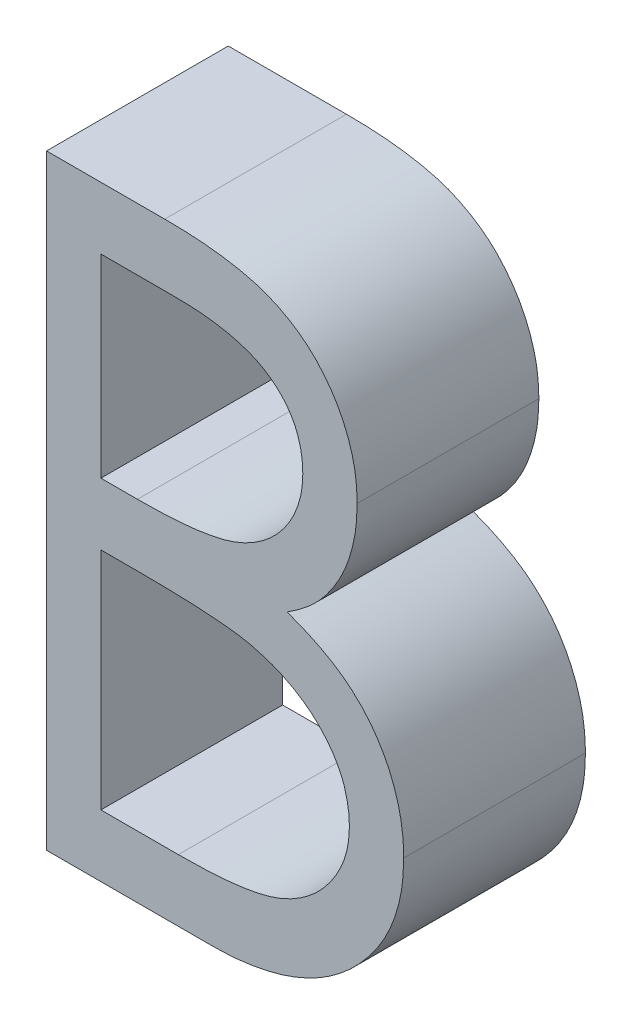
ISO-10303-21;
HEADER;
FILE_DESCRIPTION(('STEP AP214'),'2;1');
FILE_NAME('part.step','',(''),(''),'','','');
FILE_SCHEMA(('AUTOMOTIVE_DESIGN { 1 0 10303 214 1 1 1 1 }'));
ENDSEC;
DATA;
#1=APPLICATION_CONTEXT('core data for automotive mechanical design processes');
#2=APPLICATION_PROTOCOL_DEFINITION('international standard','automotive_design',2000,#1);
#3=PRODUCT_CONTEXT('',#1,'mechanical');
#4=PRODUCT('Part','Part','',(#3));
#5=PRODUCT_RELATED_PRODUCT_CATEGORY('part','',(#4));
#6=PRODUCT_DEFINITION_FORMATION('','',#4);
#7=PRODUCT_DEFINITION_CONTEXT('part definition',#1,'design');
#8=PRODUCT_DEFINITION('design','',#6,#7);
#9=PRODUCT_DEFINITION_SHAPE('','',#8);
#10=(LENGTH_UNIT() NAMED_UNIT(*) SI_UNIT(.MILLI.,.METRE.));
#11=(NAMED_UNIT(*) PLANE_ANGLE_UNIT() SI_UNIT($,.RADIAN.));
#12=(NAMED_UNIT(*) SI_UNIT($,.STERADIAN.) SOLID_ANGLE_UNIT());
#13=UNCERTAINTY_MEASURE_WITH_UNIT(LENGTH_MEASURE(1.E-05),#10,'distance_accuracy_value','');
#14=(GEOMETRIC_REPRESENTATION_CONTEXT(3) GLOBAL_UNCERTAINTY_ASSIGNED_CONTEXT((#13)) GLOBAL_UNIT_ASSIGNED_CONTEXT((#10,
#11,#12)) REPRESENTATION_CONTEXT('',''));
#15=CARTESIAN_POINT('',(0.,0.,0.));
#16=DIRECTION('',(0.,0.,1.));
#17=DIRECTION('',(1.,0.,0.));
#18=AXIS2_PLACEMENT_3D('',#15,#16,#17);
#19=CARTESIAN_POINT('',(-53.3591586970014,-18.1224061676511,1.5));
#20=DIRECTION('',(0.,0.,1.));
#21=DIRECTION('',(1.,0.,0.));
#22=AXIS2_PLACEMENT_3D('',#19,#20,#21);
#23=PLANE('',#22);
#24=DIRECTION('',(0.,-1.,0.));
#25=VECTOR('',#24,1.);
#26=CARTESIAN_POINT('',(-54.9837473771516,-18.3829395890513,1.5));
#27=LINE('',#26,#25);
#28=CARTESIAN_POINT('',(-54.9837473771516,-18.3829395890513,1.5));
#29=VERTEX_POINT('',#28);
#30=CARTESIAN_POINT('',(-54.9837473771516,-19.9855036916154,1.5));
#31=VERTEX_POINT('',#30);
#32=EDGE_CURVE('E554',#29,#31,#27,.T.);
#33=ORIENTED_EDGE('',*,*,#32,.F.);
#34=DIRECTION('',(-1.,0.,0.));
#35=VECTOR('',#34,1.);
#36=CARTESIAN_POINT('',(-54.3747730181772,-18.3829395890513,1.5));
#37=LINE('',#36,#35);
#38=CARTESIAN_POINT('',(-54.3747730181772,-18.3829395890513,1.5));
#39=VERTEX_POINT('',#38);
#40=EDGE_CURVE('E256',#39,#29,#37,.T.);
#41=ORIENTED_EDGE('',*,*,#40,.F.);
#42=CARTESIAN_POINT('',(-53.3170807104849,-19.1181158711026,1.5));
#43=CARTESIAN_POINT('',(-53.3178323964618,-19.0903647689404,1.5));
#44=CARTESIAN_POINT('',(-53.3193069105889,-19.035927951651,1.5));
#45=CARTESIAN_POINT('',(-53.3313830571674,-18.9565717314275,1.5));
#46=CARTESIAN_POINT('',(-53.3519081635039,-18.8819377992673,1.5));
#47=CARTESIAN_POINT('',(-53.3782714395612,-18.8110033559469,1.5));
#48=CARTESIAN_POINT('',(-53.4151124234417,-18.7459864270608,1.5));
#49=CARTESIAN_POINT('',(-53.4584887995875,-18.6846390046396,1.5));
#50=CARTESIAN_POINT('',(-53.5108969285728,-18.6290502639297,1.5));
#51=CARTESIAN_POINT('',(-53.570550232367,-18.577093837765,1.5));
#52=CARTESIAN_POINT('',(-53.6391339793076,-18.5310302266249,1.5));
#53=CARTESIAN_POINT('',(-53.7166072533351,-18.4906862792341,1.5));
#54=CARTESIAN_POINT('',(-53.8040182205734,-18.4581994554058,1.5));
#55=CARTESIAN_POINT('',(-53.8998937276897,-18.4297478090092,1.5));
#56=CARTESIAN_POINT('',(-54.0057095669735,-18.409764532126,1.5));
#57=CARTESIAN_POINT('',(-54.1202446432715,-18.393116835473,1.5));
#58=CARTESIAN_POINT('',(-54.2444370990243,-18.3846414897522,1.5));
#59=CARTESIAN_POINT('',(-54.330358674061,-18.3835195427883,1.5));
#60=CARTESIAN_POINT('',(-54.3747730181772,-18.3829395890513,1.5));
#61=B_SPLINE_CURVE_WITH_KNOTS('',3,(#42,#43,#44,#45,#46,#47,#48,#49,#50,#51,#52,#53,#54,#55,#56,
#57,#58,#59,#60),.UNSPECIFIED.,.F.,.F.,(4,1,1,1,1,1,1,1,1,1,1,1,1,1,1,1,4),(0.,
0.0570031325129228,0.111817869120722,0.164402372218211,0.215869804898794,0.266841110081868,
0.317478963205359,0.369902136272758,0.423400449443637,0.47971839829945,0.539241496644295,
0.602430688943423,0.671029546147334,0.744484797560848,0.823453971378682,0.908740312730665,1.),.UNSPECIFIED.);
#62=CARTESIAN_POINT('',(-53.3170807104849,-19.1181158711026,1.5));
#63=VERTEX_POINT('',#62);
#64=EDGE_CURVE('E221',#63,#39,#61,.T.);
#65=ORIENTED_EDGE('',*,*,#64,.F.);
#66=CARTESIAN_POINT('',(-54.6822650053567,-19.9855036916154,1.5));
#67=CARTESIAN_POINT('',(-54.6381952976903,-19.9849323730347,1.5));
#68=CARTESIAN_POINT('',(-54.5530436416154,-19.9838284691091,1.5));
#69=CARTESIAN_POINT('',(-54.4297295036743,-19.9806663018778,1.5));
#70=CARTESIAN_POINT('',(-54.3152651919655,-19.9718119541392,1.5));
#71=CARTESIAN_POINT('',(-54.2098482875741,-19.962960151204,1.5));
#72=CARTESIAN_POINT('',(-54.1136447961932,-19.9485678831129,1.5));
#73=CARTESIAN_POINT('',(-54.0268678511902,-19.9314362789524,1.5));
#74=CARTESIAN_POINT('',(-53.9481555698494,-19.9133178431003,1.5));
#75=CARTESIAN_POINT('',(-53.8573847905117,-19.8825042903855,1.5));
#76=CARTESIAN_POINT('',(-53.7544234355715,-19.8369647544085,1.5));
#77=CARTESIAN_POINT('',(-53.6446618582081,-19.7662907028085,1.5));
#78=CARTESIAN_POINT('',(-53.547898330224,-19.6821130553812,1.5));
#79=CARTESIAN_POINT('',(-53.4661880620536,-19.5849831100169,1.5));
#80=CARTESIAN_POINT('',(-53.399314532727,-19.4780314159339,1.5));
#81=CARTESIAN_POINT('',(-53.3528663682209,-19.3629644438842,1.5));
#82=CARTESIAN_POINT('',(-53.3213702479601,-19.2426499695477,1.5));
#83=CARTESIAN_POINT('',(-53.3185252031641,-19.1600524655623,1.5));
#84=CARTESIAN_POINT('',(-53.3170807104849,-19.1181158711026,1.5));
#85=B_SPLINE_CURVE_WITH_KNOTS('',3,(#66,#67,#68,#69,#70,#71,#72,#73,#74,#75,#76,#77,#78,#79,#80,
#81,#82,#83,#84),.UNSPECIFIED.,.F.,.F.,(4,1,1,1,1,1,1,1,1,1,1,1,1,1,1,1,4),(0.,
0.0723010339955057,0.139700331739384,0.202288511484772,0.260599533222202,0.313190329155331,
0.361738932985426,0.405706475632223,0.445539984894872,0.518831955861608,0.589778239583577,
0.658867478656144,0.728430478061063,0.7972827036081,0.864815377401444,0.931363752879269,1.),.UNSPECIFIED.);
#86=CARTESIAN_POINT('',(-54.6822650053567,-19.9855036916154,1.5));
#87=VERTEX_POINT('',#86);
#88=EDGE_CURVE('E227',#87,#63,#85,.T.);
#89=ORIENTED_EDGE('',*,*,#88,.F.);
#90=DIRECTION('',(1.,0.,0.));
#91=VECTOR('',#90,1.);
#92=CARTESIAN_POINT('',(-54.9837473771516,-19.9855036916154,1.5));
#93=LINE('',#92,#91);
#94=EDGE_CURVE('E555',#31,#87,#93,.T.);
#95=ORIENTED_EDGE('',*,*,#94,.F.);
#96=EDGE_LOOP('',(#33,#41,#65,#89,#95));
#97=FACE_BOUND('',#96,.T.);
#98=DIRECTION('',(0.,1.,0.));
#99=VECTOR('',#98,1.);
#100=CARTESIAN_POINT('',(-55.4324653258695,-22.8701190762308,1.5));
#101=LINE('',#100,#99);
#102=CARTESIAN_POINT('',(-55.4324653258695,-22.8701190762308,1.5));
#103=VERTEX_POINT('',#102);
#104=CARTESIAN_POINT('',(-55.4324653258695,-17.8701190762308,1.5));
#105=VERTEX_POINT('',#104);
#106=EDGE_CURVE('E272',#103,#105,#101,.T.);
#107=ORIENTED_EDGE('',*,*,#106,.F.);
#108=DIRECTION('',(-1.,0.,0.));
#109=VECTOR('',#108,1.);
#110=CARTESIAN_POINT('',(-54.0803018643311,-22.8701190762308,1.5));
#111=LINE('',#110,#109);
#112=CARTESIAN_POINT('',(-54.0803018643311,-22.8701190762308,1.5));
#113=VERTEX_POINT('',#112);
#114=EDGE_CURVE('E339',#113,#103,#111,.T.);
#115=ORIENTED_EDGE('',*,*,#114,.F.);
#116=CARTESIAN_POINT('',(-52.4837473771516,-21.4508482428975,1.5));
#117=CARTESIAN_POINT('',(-52.4851428714707,-21.4996580602145,1.5));
#118=CARTESIAN_POINT('',(-52.487888545639,-21.5956927432235,1.5));
#119=CARTESIAN_POINT('',(-52.5081456482058,-21.7367715068671,1.5));
#120=CARTESIAN_POINT('',(-52.5424443724785,-21.8715928591711,1.5));
#121=CARTESIAN_POINT('',(-52.5896888672852,-22.0010288344629,1.5));
#122=CARTESIAN_POINT('',(-52.6513493167114,-22.1248290265638,1.5));
#123=CARTESIAN_POINT('',(-52.7263892657563,-22.2431336894017,1.5));
#124=CARTESIAN_POINT('',(-52.8158629280747,-22.3547541617061,1.5));
#125=CARTESIAN_POINT('',(-52.9159527408631,-22.460930766139,1.5));
#126=CARTESIAN_POINT('',(-53.0291843772755,-22.5563990337672,1.5));
#127=CARTESIAN_POINT('',(-53.1513497414505,-22.6414214718834,1.5));
#128=CARTESIAN_POINT('',(-53.2839873412987,-22.7113444177626,1.5));
#129=CARTESIAN_POINT('',(-53.4249187613221,-22.7700815913381,1.5));
#130=CARTESIAN_POINT('',(-53.5757249271996,-22.8149490177168,1.5));
#131=CARTESIAN_POINT('',(-53.7357286519993,-22.8463384090015,1.5));
#132=CARTESIAN_POINT('',(-53.904791940335,-22.8674884618566,1.5));
#133=CARTESIAN_POINT('',(-54.0208058704943,-22.8692273259923,1.5));
#134=CARTESIAN_POINT('',(-54.0803018643311,-22.8701190762308,1.5));
#135=B_SPLINE_CURVE_WITH_KNOTS('',3,(#116,#117,#118,#119,#120,#121,#122,#123,#124,#125,#126,
#127,#128,#129,#130,#131,#132,#133,#134),.UNSPECIFIED.,.F.,.F.,(4,1,1,1,1,1,1,1,1,1,1,1,1,1,1,1,
4),(0.,0.0611602766365175,0.120334557726202,0.178180255063124,0.235235125986364,
0.29268296144418,0.351186248215079,0.410456609509694,0.471719854462994,0.533761202772588,
0.595739023887094,0.657887515124884,0.72129518029146,0.786822514541889,0.854686153828683,
0.925477986269997,1.),.UNSPECIFIED.);
#136=CARTESIAN_POINT('',(-52.4837473771516,-21.4508482428975,1.5));
#137=VERTEX_POINT('',#136);
#138=EDGE_CURVE('E333',#137,#113,#135,.T.);
#139=ORIENTED_EDGE('',*,*,#138,.F.);
#140=CARTESIAN_POINT('',(-53.4462874412542,-20.1728033711026,1.5));
#141=CARTESIAN_POINT('',(-53.3894868304045,-20.1946105124464,1.5));
#142=CARTESIAN_POINT('',(-53.2808131912911,-20.2363329758677,1.5));
#143=CARTESIAN_POINT('',(-53.1312617449597,-20.3100979244349,1.5));
#144=CARTESIAN_POINT('',(-53.0024119663938,-20.3903295107083,1.5));
#145=CARTESIAN_POINT('',(-52.893273186415,-20.477946439485,1.5));
#146=CARTESIAN_POINT('',(-52.7999336793912,-20.5723875977566,1.5));
#147=CARTESIAN_POINT('',(-52.7184294771442,-20.6750377609685,1.5));
#148=CARTESIAN_POINT('',(-52.6488846569144,-20.7872359865077,1.5));
#149=CARTESIAN_POINT('',(-52.5892947661064,-20.9078124655968,1.5));
#150=CARTESIAN_POINT('',(-52.5427965432118,-21.0355359918209,1.5));
#151=CARTESIAN_POINT('',(-52.5079738226836,-21.1692085291029,1.5));
#152=CARTESIAN_POINT('',(-52.4880203239182,-21.3083507508091,1.5));
#153=CARTESIAN_POINT('',(-52.4851808363779,-21.4030441498641,1.5));
#154=CARTESIAN_POINT('',(-52.4837473771516,-21.4508482428975,1.5));
#155=B_SPLINE_CURVE_WITH_KNOTS('',3,(#140,#141,#142,#143,#144,#145,#146,#147,#148,#149,#150,
#151,#152,#153,#154),.UNSPECIFIED.,.F.,.F.,(4,1,1,1,1,1,1,1,1,1,1,1,4),(0.,0.106057493303395,
0.202914257084609,0.290300165395838,0.370222565625039,0.44638372077097,0.521396899964828,
0.598291082846457,0.676142468856928,0.755528699556021,0.834887172457657,0.91664604874664,1.),.UNSPECIFIED.);
#156=CARTESIAN_POINT('',(-53.4462874412542,-20.1728033711026,1.5));
#157=VERTEX_POINT('',#156);
#158=EDGE_CURVE('E340',#157,#137,#155,.T.);
#159=ORIENTED_EDGE('',*,*,#158,.F.);
#160=CARTESIAN_POINT('',(-52.868362761767,-19.1091014480257,1.5));
#161=CARTESIAN_POINT('',(-52.8699245023992,-19.1643193847085,1.5));
#162=CARTESIAN_POINT('',(-52.8729934700208,-19.2728278375957,1.5));
#163=CARTESIAN_POINT('',(-52.9023402690676,-19.4315337080009,1.5));
#164=CARTESIAN_POINT('',(-52.9482840811241,-19.5826068777542,1.5));
#165=CARTESIAN_POINT('',(-53.0121487227869,-19.7254959997784,1.5));
#166=CARTESIAN_POINT('',(-53.0951515744985,-19.8569725899864,1.5));
#167=CARTESIAN_POINT('',(-53.1935206011629,-19.9780972557651,1.5));
#168=CARTESIAN_POINT('',(-53.3122017475786,-20.0837416229007,1.5));
#169=CARTESIAN_POINT('',(-53.401120661847,-20.1428029122589,1.5));
#170=CARTESIAN_POINT('',(-53.4462874412542,-20.1728033711026,1.5));
#171=B_SPLINE_CURVE_WITH_KNOTS('',3,(#160,#161,#162,#163,#164,#165,#166,#167,#168,#169,#170),
.UNSPECIFIED.,.F.,.F.,(4,1,1,1,1,1,1,1,4),(0.,0.13056910708731,0.256580608694084,
0.380551616803684,0.50362291720071,0.62573932316979,0.747548581959627,0.871766118564871,1.),.UNSPECIFIED.);
#172=CARTESIAN_POINT('',(-52.868362761767,-19.1091014480257,1.5));
#173=VERTEX_POINT('',#172);
#174=EDGE_CURVE('E285',#173,#157,#171,.T.);
#175=ORIENTED_EDGE('',*,*,#174,.F.);
#176=CARTESIAN_POINT('',(-54.4569044284336,-17.8701190762308,1.5));
#177=CARTESIAN_POINT('',(-54.4091494595939,-17.8703701482333,1.5));
#178=CARTESIAN_POINT('',(-54.3165884448276,-17.8708567882605,1.5));
#179=CARTESIAN_POINT('',(-54.1819892422151,-17.8784041184705,1.5));
#180=CARTESIAN_POINT('',(-54.0559195127287,-17.8886950754399,1.5));
#181=CARTESIAN_POINT('',(-53.938342695085,-17.9050237792174,1.5));
#182=CARTESIAN_POINT('',(-53.8293131202406,-17.9247263179964,1.5));
#183=CARTESIAN_POINT('',(-53.7285022099008,-17.9485860552683,1.5));
#184=CARTESIAN_POINT('',(-53.6362305352318,-17.9771955033527,1.5));
#185=CARTESIAN_POINT('',(-53.526069483223,-18.0226901908276,1.5));
#186=CARTESIAN_POINT('',(-53.4004685391104,-18.0902947170415,1.5));
#187=CARTESIAN_POINT('',(-53.264470835249,-18.1901926672543,1.5));
#188=CARTESIAN_POINT('',(-53.1481790647357,-18.3123819002834,1.5));
#189=CARTESIAN_POINT('',(-53.0479128972486,-18.4502142651753,1.5));
#190=CARTESIAN_POINT('',(-52.9681970120897,-18.6018367962482,1.5));
#191=CARTESIAN_POINT('',(-52.910526587353,-18.763635637359,1.5));
#192=CARTESIAN_POINT('',(-52.8740153368407,-18.9335238401012,1.5));
#193=CARTESIAN_POINT('',(-52.8702604308179,-19.0501569513568,1.5));
#194=CARTESIAN_POINT('',(-52.868362761767,-19.1091014480257,1.5));
#195=B_SPLINE_CURVE_WITH_KNOTS('',3,(#176,#177,#178,#179,#180,#181,#182,#183,#184,#185,#186,
#187,#188,#189,#190,#191,#192,#193,#194),.UNSPECIFIED.,.F.,.F.,(4,1,1,1,1,1,1,1,1,1,1,1,1,1,1,1,
4),(0.,0.0625940971873324,0.121322938634751,0.176680142197766,0.228365095709677,
0.276868445836809,0.321879127666047,0.364098625109894,0.403355696242704,0.477967948163373,
0.550535461364776,0.623584456740324,0.698174882264205,0.773353670340877,0.847281125497734,
0.92281833955667,1.),.UNSPECIFIED.);
#196=CARTESIAN_POINT('',(-54.4569044284336,-17.8701190762308,1.5));
#197=VERTEX_POINT('',#196);
#198=EDGE_CURVE('E279',#197,#173,#195,.T.);
#199=ORIENTED_EDGE('',*,*,#198,.F.);
#200=DIRECTION('',(1.,0.,0.));
#201=VECTOR('',#200,1.);
#202=CARTESIAN_POINT('',(-55.4324653258695,-17.8701190762308,1.5));
#203=LINE('',#202,#201);
#204=EDGE_CURVE('E275',#105,#197,#203,.T.);
#205=ORIENTED_EDGE('',*,*,#204,.F.);
#206=EDGE_LOOP('',(#107,#115,#139,#159,#175,#199,#205));
#207=FACE_BOUND('',#206,.T.);
#208=DIRECTION('',(0.,-1.,0.));
#209=VECTOR('',#208,1.);
#210=CARTESIAN_POINT('',(-54.9837473771516,-20.4983242044359,1.5));
#211=LINE('',#210,#209);
#212=CARTESIAN_POINT('',(-54.9837473771516,-20.4983242044359,1.5));
#213=VERTEX_POINT('',#212);
#214=CARTESIAN_POINT('',(-54.9837473771516,-22.3572985634103,1.5));
#215=VERTEX_POINT('',#214);
#216=EDGE_CURVE('E167',#213,#215,#211,.T.);
#217=ORIENTED_EDGE('',*,*,#216,.F.);
#218=DIRECTION('',(-1.,0.,0.));
#219=VECTOR('',#218,1.);
#220=CARTESIAN_POINT('',(-54.6862714156131,-20.4983242044359,1.5));
#221=LINE('',#220,#219);
#222=CARTESIAN_POINT('',(-54.6862714156131,-20.4983242044359,1.5));
#223=VERTEX_POINT('',#222);
#224=EDGE_CURVE('E159',#223,#213,#221,.T.);
#225=ORIENTED_EDGE('',*,*,#224,.F.);
#226=CARTESIAN_POINT('',(-53.7507746207413,-20.557418755718,1.5));
#227=CARTESIAN_POINT('',(-53.7751019005303,-20.552482921496,1.5));
#228=CARTESIAN_POINT('',(-53.8278484610288,-20.5417810148027,1.5));
#229=CARTESIAN_POINT('',(-53.9138592902129,-20.530484295675,1.5));
#230=CARTESIAN_POINT('',(-54.0120533886446,-20.5204199244005,1.5));
#231=CARTESIAN_POINT('',(-54.1226574989676,-20.5129754134524,1.5));
#232=CARTESIAN_POINT('',(-54.2458115577014,-20.5052803512409,1.5));
#233=CARTESIAN_POINT('',(-54.3817785843952,-20.5022877496376,1.5));
#234=CARTESIAN_POINT('',(-54.5300033196226,-20.4987173780756,1.5));
#235=CARTESIAN_POINT('',(-54.6328495659079,-20.498458614873,1.5));
#236=CARTESIAN_POINT('',(-54.6862714156131,-20.4983242044359,1.5));
#237=B_SPLINE_CURVE_WITH_KNOTS('',3,(#226,#227,#228,#229,#230,#231,#232,#233,#234,#235,#236),
.UNSPECIFIED.,.F.,.F.,(4,1,1,1,1,1,1,1,4),(0.,0.0793064855229938,0.17195281892793,
0.277056507391587,0.394730575864472,0.526177321276757,0.671344766597607,0.829285257189252,1.),.UNSPECIFIED.);
#238=CARTESIAN_POINT('',(-53.7507746207413,-20.557418755718,1.5));
#239=VERTEX_POINT('',#238);
#240=EDGE_CURVE('E510',#239,#223,#237,.T.);
#241=ORIENTED_EDGE('',*,*,#240,.F.);
#242=CARTESIAN_POINT('',(-52.9324653258695,-21.4508482428975,1.5));
#243=CARTESIAN_POINT('',(-52.9328597606373,-21.4244291850188,1.5));
#244=CARTESIAN_POINT('',(-52.9336422679045,-21.3720172110401,1.5));
#245=CARTESIAN_POINT('',(-52.9454431463669,-21.2949946122002,1.5));
#246=CARTESIAN_POINT('',(-52.9626058175008,-21.2203862217584,1.5));
#247=CARTESIAN_POINT('',(-52.9847935801902,-21.1479894496373,1.5));
#248=CARTESIAN_POINT('',(-53.017107104606,-21.0791131977119,1.5));
#249=CARTESIAN_POINT('',(-53.0548307403447,-21.0123952555165,1.5));
#250=CARTESIAN_POINT('',(-53.0990613141227,-20.9477474277683,1.5));
#251=CARTESIAN_POINT('',(-53.1679815510765,-20.8660156371263,1.5));
#252=CARTESIAN_POINT('',(-53.2682272432479,-20.7718484758358,1.5));
#253=CARTESIAN_POINT('',(-53.4106654938806,-20.6796520440262,1.5));
#254=CARTESIAN_POINT('',(-53.572625919551,-20.6052980339013,1.5));
#255=CARTESIAN_POINT('',(-53.6900937665454,-20.5737273534178,1.5));
#256=CARTESIAN_POINT('',(-53.7507746207413,-20.557418755718,1.5));
#257=B_SPLINE_CURVE_WITH_KNOTS('',3,(#242,#243,#244,#245,#246,#247,#248,#249,#250,#251,#252,
#253,#254,#255,#256),.UNSPECIFIED.,.F.,.F.,(4,1,1,1,1,1,1,1,1,1,1,1,4),(0.,0.0602873979279706,
0.119602354707522,0.17750337101854,0.235142663732331,0.292132593226933,0.350871208641565,
0.410097862566591,0.470731521530447,0.594828704080412,0.722578824094292,0.856691389544017,1.),.UNSPECIFIED.);
#258=CARTESIAN_POINT('',(-52.9324653258695,-21.4508482428975,1.5));
#259=VERTEX_POINT('',#258);
#260=EDGE_CURVE('E189',#259,#239,#257,.T.);
#261=ORIENTED_EDGE('',*,*,#260,.F.);
#262=CARTESIAN_POINT('',(-54.3447249412542,-22.3572985634103,1.5));
#263=CARTESIAN_POINT('',(-54.2989836185213,-22.3567503528435,1.5));
#264=CARTESIAN_POINT('',(-54.2108232491252,-22.3556937492478,1.5));
#265=CARTESIAN_POINT('',(-54.0835357775239,-22.3522443855894,1.5));
#266=CARTESIAN_POINT('',(-53.9655599149509,-22.3443982774479,1.5));
#267=CARTESIAN_POINT('',(-53.857434006766,-22.3320470636426,1.5));
#268=CARTESIAN_POINT('',(-53.7579905030079,-22.318649279111,1.5));
#269=CARTESIAN_POINT('',(-53.6684223558237,-22.3006331635086,1.5));
#270=CARTESIAN_POINT('',(-53.5880035080217,-22.2799917913294,1.5));
#271=CARTESIAN_POINT('',(-53.4947544969654,-22.2480858309936,1.5));
#272=CARTESIAN_POINT('',(-53.3897494851355,-22.1985194439689,1.5));
#273=CARTESIAN_POINT('',(-53.2765911188703,-22.1237848348,1.5));
#274=CARTESIAN_POINT('',(-53.1759822358074,-22.0347515379817,1.5));
#275=CARTESIAN_POINT('',(-53.0905461512265,-21.9317073748765,1.5));
#276=CARTESIAN_POINT('',(-53.0205275961609,-21.8196626221218,1.5));
#277=CARTESIAN_POINT('',(-52.9695912317558,-21.7008835507609,1.5));
#278=CARTESIAN_POINT('',(-52.938175722157,-21.577332797306,1.5));
#279=CARTESIAN_POINT('',(-52.9343726231715,-21.4930946365303,1.5));
#280=CARTESIAN_POINT('',(-52.9324653258695,-21.4508482428975,1.5));
#281=B_SPLINE_CURVE_WITH_KNOTS('',3,(#262,#263,#264,#265,#266,#267,#268,#269,#270,#271,#272,
#273,#274,#275,#276,#277,#278,#279,#280),.UNSPECIFIED.,.F.,.F.,(4,1,1,1,1,1,1,1,1,1,1,1,1,1,1,1,
4),(0.,0.0725024889330363,0.139738989267895,0.201795134825922,0.259821934414865,
0.312205989384599,0.36077343412434,0.40454034260075,0.443698098552764,0.516840794243969,
0.587874335944281,0.65796541756163,0.728969388647312,0.799307719954884,0.866635777834471,
0.933116329057274,1.),.UNSPECIFIED.);
#282=CARTESIAN_POINT('',(-54.3447249412542,-22.3572985634103,1.5));
#283=VERTEX_POINT('',#282);
#284=EDGE_CURVE('E182',#283,#259,#281,.T.);
#285=ORIENTED_EDGE('',*,*,#284,.F.);
#286=DIRECTION('',(1.,0.,0.));
#287=VECTOR('',#286,1.);
#288=CARTESIAN_POINT('',(-54.9837473771516,-22.3572985634103,1.5));
#289=LINE('',#288,#287);
#290=EDGE_CURVE('E180',#215,#283,#289,.T.);
#291=ORIENTED_EDGE('',*,*,#290,.F.);
#292=EDGE_LOOP('',(#217,#225,#241,#261,#285,#291));
#293=FACE_BOUND('',#292,.T.);
#294=ADVANCED_FACE('F33',(#97,#207,#293),#23,.T.);
#295=CARTESIAN_POINT('',(-53.3591586970014,-18.1224061676511,0.));
#296=DIRECTION('',(0.,0.,1.));
#297=DIRECTION('',(1.,0.,0.));
#298=AXIS2_PLACEMENT_3D('',#295,#296,#297);
#299=PLANE('',#298);
#300=DIRECTION('',(-1.,0.,0.));
#301=VECTOR('',#300,1.);
#302=CARTESIAN_POINT('',(-54.3747730181772,-18.3829395890513,0.));
#303=LINE('',#302,#301);
#304=CARTESIAN_POINT('',(-54.3747730181772,-18.3829395890513,0.));
#305=VERTEX_POINT('',#304);
#306=CARTESIAN_POINT('',(-54.9837473771516,-18.3829395890513,0.));
#307=VERTEX_POINT('',#306);
#308=EDGE_CURVE('E175',#305,#307,#303,.T.);
#309=ORIENTED_EDGE('',*,*,#308,.T.);
#310=DIRECTION('',(0.,-1.,0.));
#311=VECTOR('',#310,1.);
#312=CARTESIAN_POINT('',(-54.9837473771516,-18.3829395890513,0.));
#313=LINE('',#312,#311);
#314=CARTESIAN_POINT('',(-54.9837473771516,-19.9855036916154,0.));
#315=VERTEX_POINT('',#314);
#316=EDGE_CURVE('E237',#307,#315,#313,.T.);
#317=ORIENTED_EDGE('',*,*,#316,.T.);
#318=DIRECTION('',(1.,0.,0.));
#319=VECTOR('',#318,1.);
#320=CARTESIAN_POINT('',(-54.9837473771516,-19.9855036916154,0.));
#321=LINE('',#320,#319);
#322=CARTESIAN_POINT('',(-54.6822650053567,-19.9855036916154,0.));
#323=VERTEX_POINT('',#322);
#324=EDGE_CURVE('E240',#315,#323,#321,.T.);
#325=ORIENTED_EDGE('',*,*,#324,.T.);
#326=CARTESIAN_POINT('',(-54.6822650053567,-19.9855036916154,0.));
#327=CARTESIAN_POINT('',(-54.6381952976903,-19.9849323730347,0.));
#328=CARTESIAN_POINT('',(-54.5530436416154,-19.9838284691091,0.));
#329=CARTESIAN_POINT('',(-54.4297295036743,-19.9806663018778,0.));
#330=CARTESIAN_POINT('',(-54.3152651919655,-19.9718119541392,0.));
#331=CARTESIAN_POINT('',(-54.2098482875741,-19.962960151204,0.));
#332=CARTESIAN_POINT('',(-54.1136447961932,-19.9485678831129,0.));
#333=CARTESIAN_POINT('',(-54.0268678511902,-19.9314362789524,0.));
#334=CARTESIAN_POINT('',(-53.9481555698494,-19.9133178431003,0.));
#335=CARTESIAN_POINT('',(-53.8573847905117,-19.8825042903855,0.));
#336=CARTESIAN_POINT('',(-53.7544234355715,-19.8369647544085,0.));
#337=CARTESIAN_POINT('',(-53.6446618582081,-19.7662907028085,0.));
#338=CARTESIAN_POINT('',(-53.547898330224,-19.6821130553812,0.));
#339=CARTESIAN_POINT('',(-53.4661880620536,-19.5849831100169,0.));
#340=CARTESIAN_POINT('',(-53.399314532727,-19.4780314159339,0.));
#341=CARTESIAN_POINT('',(-53.3528663682209,-19.3629644438842,0.));
#342=CARTESIAN_POINT('',(-53.3213702479601,-19.2426499695477,0.));
#343=CARTESIAN_POINT('',(-53.3185252031641,-19.1600524655623,0.));
#344=CARTESIAN_POINT('',(-53.3170807104849,-19.1181158711026,0.));
#345=B_SPLINE_CURVE_WITH_KNOTS('',3,(#326,#327,#328,#329,#330,#331,#332,#333,#334,#335,#336,
#337,#338,#339,#340,#341,#342,#343,#344),.UNSPECIFIED.,.F.,.F.,(4,1,1,1,1,1,1,1,1,1,1,1,1,1,1,1,
4),(0.,0.0723010339955057,0.139700331739384,0.202288511484772,0.260599533222202,
0.313190329155331,0.361738932985426,0.405706475632223,0.445539984894872,0.518831955861608,
0.589778239583577,0.658867478656144,0.728430478061063,0.7972827036081,0.864815377401444,
0.931363752879269,1.),.UNSPECIFIED.);
#346=CARTESIAN_POINT('',(-53.3170807104849,-19.1181158711026,0.));
#347=VERTEX_POINT('',#346);
#348=EDGE_CURVE('E243',#323,#347,#345,.T.);
#349=ORIENTED_EDGE('',*,*,#348,.T.);
#350=CARTESIAN_POINT('',(-53.3170807104849,-19.1181158711026,0.));
#351=CARTESIAN_POINT('',(-53.3178323964618,-19.0903647689404,0.));
#352=CARTESIAN_POINT('',(-53.3193069105889,-19.035927951651,0.));
#353=CARTESIAN_POINT('',(-53.3313830571674,-18.9565717314275,0.));
#354=CARTESIAN_POINT('',(-53.3519081635039,-18.8819377992673,0.));
#355=CARTESIAN_POINT('',(-53.3782714395612,-18.8110033559469,0.));
#356=CARTESIAN_POINT('',(-53.4151124234417,-18.7459864270608,0.));
#357=CARTESIAN_POINT('',(-53.4584887995875,-18.6846390046396,0.));
#358=CARTESIAN_POINT('',(-53.5108969285728,-18.6290502639297,0.));
#359=CARTESIAN_POINT('',(-53.570550232367,-18.577093837765,0.));
#360=CARTESIAN_POINT('',(-53.6391339793076,-18.5310302266249,0.));
#361=CARTESIAN_POINT('',(-53.7166072533351,-18.4906862792341,0.));
#362=CARTESIAN_POINT('',(-53.8040182205734,-18.4581994554058,0.));
#363=CARTESIAN_POINT('',(-53.8998937276897,-18.4297478090092,0.));
#364=CARTESIAN_POINT('',(-54.0057095669735,-18.409764532126,0.));
#365=CARTESIAN_POINT('',(-54.1202446432715,-18.393116835473,0.));
#366=CARTESIAN_POINT('',(-54.2444370990243,-18.3846414897522,0.));
#367=CARTESIAN_POINT('',(-54.330358674061,-18.3835195427883,0.));
#368=CARTESIAN_POINT('',(-54.3747730181772,-18.3829395890513,0.));
#369=B_SPLINE_CURVE_WITH_KNOTS('',3,(#350,#351,#352,#353,#354,#355,#356,#357,#358,#359,#360,
#361,#362,#363,#364,#365,#366,#367,#368),.UNSPECIFIED.,.F.,.F.,(4,1,1,1,1,1,1,1,1,1,1,1,1,1,1,1,
4),(0.,0.0570031325129228,0.111817869120722,0.164402372218211,0.215869804898794,
0.266841110081868,0.317478963205359,0.369902136272758,0.423400449443637,0.47971839829945,
0.539241496644295,0.602430688943423,0.671029546147334,0.744484797560848,0.823453971378682,
0.908740312730665,1.),.UNSPECIFIED.);
#370=EDGE_CURVE('E248',#347,#305,#369,.T.);
#371=ORIENTED_EDGE('',*,*,#370,.T.);
#372=EDGE_LOOP('',(#309,#317,#325,#349,#371));
#373=FACE_BOUND('',#372,.T.);
#374=DIRECTION('',(0.,1.,0.));
#375=VECTOR('',#374,1.);
#376=CARTESIAN_POINT('',(-55.4324653258695,-22.8701190762308,0.));
#377=LINE('',#376,#375);
#378=CARTESIAN_POINT('',(-55.4324653258695,-22.8701190762308,0.));
#379=VERTEX_POINT('',#378);
#380=CARTESIAN_POINT('',(-55.4324653258695,-17.8701190762308,0.));
#381=VERTEX_POINT('',#380);
#382=EDGE_CURVE('E271',#379,#381,#377,.T.);
#383=ORIENTED_EDGE('',*,*,#382,.T.);
#384=DIRECTION('',(1.,0.,0.));
#385=VECTOR('',#384,1.);
#386=CARTESIAN_POINT('',(-55.4324653258695,-17.8701190762308,0.));
#387=LINE('',#386,#385);
#388=CARTESIAN_POINT('',(-54.4569044284336,-17.8701190762308,0.));
#389=VERTEX_POINT('',#388);
#390=EDGE_CURVE('E351',#381,#389,#387,.T.);
#391=ORIENTED_EDGE('',*,*,#390,.T.);
#392=CARTESIAN_POINT('',(-54.4569044284336,-17.8701190762308,0.));
#393=CARTESIAN_POINT('',(-54.4091494595939,-17.8703701482333,0.));
#394=CARTESIAN_POINT('',(-54.3165884448276,-17.8708567882605,0.));
#395=CARTESIAN_POINT('',(-54.1819892422151,-17.8784041184705,0.));
#396=CARTESIAN_POINT('',(-54.0559195127287,-17.8886950754399,0.));
#397=CARTESIAN_POINT('',(-53.938342695085,-17.9050237792174,0.));
#398=CARTESIAN_POINT('',(-53.8293131202406,-17.9247263179964,0.));
#399=CARTESIAN_POINT('',(-53.7285022099008,-17.9485860552683,0.));
#400=CARTESIAN_POINT('',(-53.6362305352318,-17.9771955033527,0.));
#401=CARTESIAN_POINT('',(-53.526069483223,-18.0226901908276,0.));
#402=CARTESIAN_POINT('',(-53.4004685391104,-18.0902947170415,0.));
#403=CARTESIAN_POINT('',(-53.264470835249,-18.1901926672543,0.));
#404=CARTESIAN_POINT('',(-53.1481790647357,-18.3123819002834,0.));
#405=CARTESIAN_POINT('',(-53.0479128972486,-18.4502142651753,0.));
#406=CARTESIAN_POINT('',(-52.9681970120897,-18.6018367962482,0.));
#407=CARTESIAN_POINT('',(-52.910526587353,-18.763635637359,0.));
#408=CARTESIAN_POINT('',(-52.8740153368407,-18.9335238401012,0.));
#409=CARTESIAN_POINT('',(-52.8702604308179,-19.0501569513568,0.));
#410=CARTESIAN_POINT('',(-52.868362761767,-19.1091014480257,0.));
#411=B_SPLINE_CURVE_WITH_KNOTS('',3,(#392,#393,#394,#395,#396,#397,#398,#399,#400,#401,#402,
#403,#404,#405,#406,#407,#408,#409,#410),.UNSPECIFIED.,.F.,.F.,(4,1,1,1,1,1,1,1,1,1,1,1,1,1,1,1,
4),(0.,0.0625940971873324,0.121322938634751,0.176680142197766,0.228365095709677,
0.276868445836809,0.321879127666047,0.364098625109894,0.403355696242704,0.477967948163373,
0.550535461364776,0.623584456740324,0.698174882264205,0.773353670340877,0.847281125497734,
0.92281833955667,1.),.UNSPECIFIED.);
#412=CARTESIAN_POINT('',(-52.868362761767,-19.1091014480257,0.));
#413=VERTEX_POINT('',#412);
#414=EDGE_CURVE('E354',#389,#413,#411,.T.);
#415=ORIENTED_EDGE('',*,*,#414,.T.);
#416=CARTESIAN_POINT('',(-52.868362761767,-19.1091014480257,0.));
#417=CARTESIAN_POINT('',(-52.8699245023992,-19.1643193847085,0.));
#418=CARTESIAN_POINT('',(-52.8729934700208,-19.2728278375957,0.));
#419=CARTESIAN_POINT('',(-52.9023402690676,-19.4315337080009,0.));
#420=CARTESIAN_POINT('',(-52.9482840811241,-19.5826068777542,0.));
#421=CARTESIAN_POINT('',(-53.0121487227869,-19.7254959997784,0.));
#422=CARTESIAN_POINT('',(-53.0951515744985,-19.8569725899864,0.));
#423=CARTESIAN_POINT('',(-53.1935206011629,-19.9780972557651,0.));
#424=CARTESIAN_POINT('',(-53.3122017475786,-20.0837416229007,0.));
#425=CARTESIAN_POINT('',(-53.401120661847,-20.1428029122589,0.));
#426=CARTESIAN_POINT('',(-53.4462874412542,-20.1728033711026,0.));
#427=B_SPLINE_CURVE_WITH_KNOTS('',3,(#416,#417,#418,#419,#420,#421,#422,#423,#424,#425,#426),
.UNSPECIFIED.,.F.,.F.,(4,1,1,1,1,1,1,1,4),(0.,0.13056910708731,0.256580608694084,
0.380551616803684,0.50362291720071,0.62573932316979,0.747548581959627,0.871766118564871,1.),.UNSPECIFIED.);
#428=CARTESIAN_POINT('',(-53.4462874412542,-20.1728033711026,0.));
#429=VERTEX_POINT('',#428);
#430=EDGE_CURVE('E359',#413,#429,#427,.T.);
#431=ORIENTED_EDGE('',*,*,#430,.T.);
#432=CARTESIAN_POINT('',(-53.4462874412542,-20.1728033711026,0.));
#433=CARTESIAN_POINT('',(-53.3894868304045,-20.1946105124464,0.));
#434=CARTESIAN_POINT('',(-53.2808131912911,-20.2363329758677,0.));
#435=CARTESIAN_POINT('',(-53.1312617449597,-20.3100979244349,0.));
#436=CARTESIAN_POINT('',(-53.0024119663938,-20.3903295107083,0.));
#437=CARTESIAN_POINT('',(-52.893273186415,-20.477946439485,0.));
#438=CARTESIAN_POINT('',(-52.7999336793912,-20.5723875977566,0.));
#439=CARTESIAN_POINT('',(-52.7184294771442,-20.6750377609685,0.));
#440=CARTESIAN_POINT('',(-52.6488846569144,-20.7872359865077,0.));
#441=CARTESIAN_POINT('',(-52.5892947661064,-20.9078124655968,0.));
#442=CARTESIAN_POINT('',(-52.5427965432118,-21.0355359918209,0.));
#443=CARTESIAN_POINT('',(-52.5079738226836,-21.1692085291029,0.));
#444=CARTESIAN_POINT('',(-52.4880203239182,-21.3083507508091,0.));
#445=CARTESIAN_POINT('',(-52.4851808363779,-21.4030441498641,0.));
#446=CARTESIAN_POINT('',(-52.4837473771516,-21.4508482428975,0.));
#447=B_SPLINE_CURVE_WITH_KNOTS('',3,(#432,#433,#434,#435,#436,#437,#438,#439,#440,#441,#442,
#443,#444,#445,#446),.UNSPECIFIED.,.F.,.F.,(4,1,1,1,1,1,1,1,1,1,1,1,4),(0.,0.106057493303395,
0.202914257084609,0.290300165395838,0.370222565625039,0.44638372077097,0.521396899964828,
0.598291082846457,0.676142468856928,0.755528699556021,0.834887172457657,0.91664604874664,1.),.UNSPECIFIED.);
#448=CARTESIAN_POINT('',(-52.4837473771516,-21.4508482428975,0.));
#449=VERTEX_POINT('',#448);
#450=EDGE_CURVE('E367',#429,#449,#447,.T.);
#451=ORIENTED_EDGE('',*,*,#450,.T.);
#452=CARTESIAN_POINT('',(-52.4837473771516,-21.4508482428975,0.));
#453=CARTESIAN_POINT('',(-52.4851428714707,-21.4996580602145,0.));
#454=CARTESIAN_POINT('',(-52.487888545639,-21.5956927432235,0.));
#455=CARTESIAN_POINT('',(-52.5081456482058,-21.7367715068671,0.));
#456=CARTESIAN_POINT('',(-52.5424443724785,-21.8715928591711,0.));
#457=CARTESIAN_POINT('',(-52.5896888672852,-22.0010288344629,0.));
#458=CARTESIAN_POINT('',(-52.6513493167114,-22.1248290265638,0.));
#459=CARTESIAN_POINT('',(-52.7263892657563,-22.2431336894017,0.));
#460=CARTESIAN_POINT('',(-52.8158629280747,-22.3547541617061,0.));
#461=CARTESIAN_POINT('',(-52.9159527408631,-22.460930766139,0.));
#462=CARTESIAN_POINT('',(-53.0291843772755,-22.5563990337672,0.));
#463=CARTESIAN_POINT('',(-53.1513497414505,-22.6414214718834,0.));
#464=CARTESIAN_POINT('',(-53.2839873412987,-22.7113444177626,0.));
#465=CARTESIAN_POINT('',(-53.4249187613221,-22.7700815913381,0.));
#466=CARTESIAN_POINT('',(-53.5757249271996,-22.8149490177168,0.));
#467=CARTESIAN_POINT('',(-53.7357286519993,-22.8463384090015,0.));
#468=CARTESIAN_POINT('',(-53.904791940335,-22.8674884618566,0.));
#469=CARTESIAN_POINT('',(-54.0208058704943,-22.8692273259923,0.));
#470=CARTESIAN_POINT('',(-54.0803018643311,-22.8701190762308,0.));
#471=B_SPLINE_CURVE_WITH_KNOTS('',3,(#452,#453,#454,#455,#456,#457,#458,#459,#460,#461,#462,
#463,#464,#465,#466,#467,#468,#469,#470),.UNSPECIFIED.,.F.,.F.,(4,1,1,1,1,1,1,1,1,1,1,1,1,1,1,1,
4),(0.,0.0611602766365175,0.120334557726202,0.178180255063124,0.235235125986364,
0.29268296144418,0.351186248215079,0.410456609509694,0.471719854462994,0.533761202772588,
0.595739023887094,0.657887515124884,0.72129518029146,0.786822514541889,0.854686153828683,
0.925477986269997,1.),.UNSPECIFIED.);
#472=CARTESIAN_POINT('',(-54.0803018643311,-22.8701190762308,0.));
#473=VERTEX_POINT('',#472);
#474=EDGE_CURVE('E375',#449,#473,#471,.T.);
#475=ORIENTED_EDGE('',*,*,#474,.T.);
#476=DIRECTION('',(-1.,0.,0.));
#477=VECTOR('',#476,1.);
#478=CARTESIAN_POINT('',(-54.0803018643311,-22.8701190762308,0.));
#479=LINE('',#478,#477);
#480=EDGE_CURVE('E276',#473,#379,#479,.T.);
#481=ORIENTED_EDGE('',*,*,#480,.T.);
#482=EDGE_LOOP('',(#383,#391,#415,#431,#451,#475,#481));
#483=FACE_BOUND('',#482,.T.);
#484=DIRECTION('',(-1.,0.,0.));
#485=VECTOR('',#484,1.);
#486=CARTESIAN_POINT('',(-54.6862714156131,-20.4983242044359,0.));
#487=LINE('',#486,#485);
#488=CARTESIAN_POINT('',(-54.6862714156131,-20.4983242044359,0.));
#489=VERTEX_POINT('',#488);
#490=CARTESIAN_POINT('',(-54.9837473771516,-20.4983242044359,0.));
#491=VERTEX_POINT('',#490);
#492=EDGE_CURVE('E58',#489,#491,#487,.T.);
#493=ORIENTED_EDGE('',*,*,#492,.T.);
#494=DIRECTION('',(0.,-1.,0.));
#495=VECTOR('',#494,1.);
#496=CARTESIAN_POINT('',(-54.9837473771516,-20.4983242044359,0.));
#497=LINE('',#496,#495);
#498=CARTESIAN_POINT('',(-54.9837473771516,-22.3572985634103,0.));
#499=VERTEX_POINT('',#498);
#500=EDGE_CURVE('E174',#491,#499,#497,.T.);
#501=ORIENTED_EDGE('',*,*,#500,.T.);
#502=DIRECTION('',(1.,0.,0.));
#503=VECTOR('',#502,1.);
#504=CARTESIAN_POINT('',(-54.9837473771516,-22.3572985634103,0.));
#505=LINE('',#504,#503);
#506=CARTESIAN_POINT('',(-54.3447249412542,-22.3572985634103,0.));
#507=VERTEX_POINT('',#506);
#508=EDGE_CURVE('E520',#499,#507,#505,.T.);
#509=ORIENTED_EDGE('',*,*,#508,.T.);
#510=CARTESIAN_POINT('',(-54.3447249412542,-22.3572985634103,0.));
#511=CARTESIAN_POINT('',(-54.2989836185213,-22.3567503528435,0.));
#512=CARTESIAN_POINT('',(-54.2108232491252,-22.3556937492478,0.));
#513=CARTESIAN_POINT('',(-54.0835357775239,-22.3522443855894,0.));
#514=CARTESIAN_POINT('',(-53.9655599149509,-22.3443982774479,0.));
#515=CARTESIAN_POINT('',(-53.857434006766,-22.3320470636426,0.));
#516=CARTESIAN_POINT('',(-53.7579905030079,-22.318649279111,0.));
#517=CARTESIAN_POINT('',(-53.6684223558237,-22.3006331635086,0.));
#518=CARTESIAN_POINT('',(-53.5880035080217,-22.2799917913294,0.));
#519=CARTESIAN_POINT('',(-53.4947544969654,-22.2480858309936,0.));
#520=CARTESIAN_POINT('',(-53.3897494851355,-22.1985194439689,0.));
#521=CARTESIAN_POINT('',(-53.2765911188703,-22.1237848348,0.));
#522=CARTESIAN_POINT('',(-53.1759822358074,-22.0347515379817,0.));
#523=CARTESIAN_POINT('',(-53.0905461512265,-21.9317073748765,0.));
#524=CARTESIAN_POINT('',(-53.0205275961609,-21.8196626221218,0.));
#525=CARTESIAN_POINT('',(-52.9695912317558,-21.7008835507609,0.));
#526=CARTESIAN_POINT('',(-52.938175722157,-21.577332797306,0.));
#527=CARTESIAN_POINT('',(-52.9343726231715,-21.4930946365303,0.));
#528=CARTESIAN_POINT('',(-52.9324653258695,-21.4508482428975,0.));
#529=B_SPLINE_CURVE_WITH_KNOTS('',3,(#510,#511,#512,#513,#514,#515,#516,#517,#518,#519,#520,
#521,#522,#523,#524,#525,#526,#527,#528),.UNSPECIFIED.,.F.,.F.,(4,1,1,1,1,1,1,1,1,1,1,1,1,1,1,1,
4),(0.,0.0725024889330363,0.139738989267895,0.201795134825922,0.259821934414865,
0.312205989384599,0.36077343412434,0.40454034260075,0.443698098552764,0.516840794243969,
0.587874335944281,0.65796541756163,0.728969388647312,0.799307719954884,0.866635777834471,
0.933116329057274,1.),.UNSPECIFIED.);
#530=CARTESIAN_POINT('',(-52.9324653258695,-21.4508482428975,0.));
#531=VERTEX_POINT('',#530);
#532=EDGE_CURVE('E523',#507,#531,#529,.T.);
#533=ORIENTED_EDGE('',*,*,#532,.T.);
#534=CARTESIAN_POINT('',(-52.9324653258695,-21.4508482428975,0.));
#535=CARTESIAN_POINT('',(-52.9328597606373,-21.4244291850188,0.));
#536=CARTESIAN_POINT('',(-52.9336422679045,-21.3720172110401,0.));
#537=CARTESIAN_POINT('',(-52.9454431463669,-21.2949946122002,0.));
#538=CARTESIAN_POINT('',(-52.9626058175008,-21.2203862217584,0.));
#539=CARTESIAN_POINT('',(-52.9847935801902,-21.1479894496373,0.));
#540=CARTESIAN_POINT('',(-53.017107104606,-21.0791131977119,0.));
#541=CARTESIAN_POINT('',(-53.0548307403447,-21.0123952555165,0.));
#542=CARTESIAN_POINT('',(-53.0990613141227,-20.9477474277683,0.));
#543=CARTESIAN_POINT('',(-53.1679815510765,-20.8660156371263,0.));
#544=CARTESIAN_POINT('',(-53.2682272432479,-20.7718484758358,0.));
#545=CARTESIAN_POINT('',(-53.4106654938806,-20.6796520440262,0.));
#546=CARTESIAN_POINT('',(-53.572625919551,-20.6052980339013,0.));
#547=CARTESIAN_POINT('',(-53.6900937665454,-20.5737273534178,0.));
#548=CARTESIAN_POINT('',(-53.7507746207413,-20.557418755718,0.));
#549=B_SPLINE_CURVE_WITH_KNOTS('',3,(#534,#535,#536,#537,#538,#539,#540,#541,#542,#543,#544,
#545,#546,#547,#548),.UNSPECIFIED.,.F.,.F.,(4,1,1,1,1,1,1,1,1,1,1,1,4),(0.,0.0602873979279706,
0.119602354707522,0.17750337101854,0.235142663732331,0.292132593226933,0.350871208641565,
0.410097862566591,0.470731521530447,0.594828704080412,0.722578824094292,0.856691389544017,1.),.UNSPECIFIED.);
#550=CARTESIAN_POINT('',(-53.7507746207413,-20.557418755718,0.));
#551=VERTEX_POINT('',#550);
#552=EDGE_CURVE('E528',#531,#551,#549,.T.);
#553=ORIENTED_EDGE('',*,*,#552,.T.);
#554=CARTESIAN_POINT('',(-53.7507746207413,-20.557418755718,0.));
#555=CARTESIAN_POINT('',(-53.7751019005303,-20.552482921496,0.));
#556=CARTESIAN_POINT('',(-53.8278484610288,-20.5417810148027,0.));
#557=CARTESIAN_POINT('',(-53.9138592902129,-20.530484295675,0.));
#558=CARTESIAN_POINT('',(-54.0120533886446,-20.5204199244005,0.));
#559=CARTESIAN_POINT('',(-54.1226574989676,-20.5129754134524,0.));
#560=CARTESIAN_POINT('',(-54.2458115577014,-20.5052803512409,0.));
#561=CARTESIAN_POINT('',(-54.3817785843952,-20.5022877496376,0.));
#562=CARTESIAN_POINT('',(-54.5300033196226,-20.4987173780756,0.));
#563=CARTESIAN_POINT('',(-54.6328495659079,-20.498458614873,0.));
#564=CARTESIAN_POINT('',(-54.6862714156131,-20.4983242044359,0.));
#565=B_SPLINE_CURVE_WITH_KNOTS('',3,(#554,#555,#556,#557,#558,#559,#560,#561,#562,#563,#564),
.UNSPECIFIED.,.F.,.F.,(4,1,1,1,1,1,1,1,4),(0.,0.0793064855229938,0.17195281892793,
0.277056507391587,0.394730575864472,0.526177321276757,0.671344766597607,0.829285257189252,1.),.UNSPECIFIED.);
#566=EDGE_CURVE('E168',#551,#489,#565,.T.);
#567=ORIENTED_EDGE('',*,*,#566,.T.);
#568=EDGE_LOOP('',(#493,#501,#509,#533,#553,#567));
#569=FACE_BOUND('',#568,.T.);
#570=ADVANCED_FACE('F312',(#373,#483,#569),#299,.F.);
#571=CARTESIAN_POINT('',(-55.4324653258695,-22.8701190762308,1.5));
#572=DIRECTION('',(-1.,0.,0.));
#573=DIRECTION('',(0.,0.,1.));
#574=AXIS2_PLACEMENT_3D('',#571,#572,#573);
#575=PLANE('',#574);
#576=ORIENTED_EDGE('',*,*,#382,.F.);
#577=DIRECTION('',(0.,0.,-1.));
#578=VECTOR('',#577,1.);
#579=CARTESIAN_POINT('',(-55.4324653258695,-22.8701190762308,1.5));
#580=LINE('',#579,#578);
#581=EDGE_CURVE('E11',#103,#379,#580,.T.);
#582=ORIENTED_EDGE('',*,*,#581,.F.);
#583=ORIENTED_EDGE('',*,*,#106,.T.);
#584=DIRECTION('',(0.,0.,-1.));
#585=VECTOR('',#584,1.);
#586=CARTESIAN_POINT('',(-55.4324653258695,-17.8701190762308,1.5));
#587=LINE('',#586,#585);
#588=EDGE_CURVE('E37',#105,#381,#587,.T.);
#589=ORIENTED_EDGE('',*,*,#588,.T.);
#590=EDGE_LOOP('',(#576,#582,#583,#589));
#591=FACE_BOUND('',#590,.T.);
#592=ADVANCED_FACE('F35',(#591),#575,.T.);
#593=CARTESIAN_POINT('',(-54.0803018643311,-22.8701190762308,1.5));
#594=DIRECTION('',(0.,-1.,0.));
#595=DIRECTION('',(0.,0.,-1.));
#596=AXIS2_PLACEMENT_3D('',#593,#594,#595);
#597=PLANE('',#596);
#598=ORIENTED_EDGE('',*,*,#480,.F.);
#599=DIRECTION('',(0.,0.,-1.));
#600=VECTOR('',#599,1.);
#601=CARTESIAN_POINT('',(-54.0803018643311,-22.8701190762308,1.5));
#602=LINE('',#601,#600);
#603=EDGE_CURVE('E42',#113,#473,#602,.T.);
#604=ORIENTED_EDGE('',*,*,#603,.F.);
#605=ORIENTED_EDGE('',*,*,#114,.T.);
#606=ORIENTED_EDGE('',*,*,#581,.T.);
#607=EDGE_LOOP('',(#598,#604,#605,#606));
#608=FACE_BOUND('',#607,.T.);
#609=ADVANCED_FACE('F324',(#608),#597,.T.);
#610=DIRECTION('',(0.,0.,-1.));
#611=VECTOR('',#610,1.);
#612=SURFACE_OF_LINEAR_EXTRUSION('',#135,#611);
#613=ORIENTED_EDGE('',*,*,#474,.F.);
#614=DIRECTION('',(0.,0.,-1.));
#615=VECTOR('',#614,1.);
#616=CARTESIAN_POINT('',(-52.4837473771516,-21.4508482428975,1.5));
#617=LINE('',#616,#615);
#618=EDGE_CURVE('E389',#137,#449,#617,.T.);
#619=ORIENTED_EDGE('',*,*,#618,.F.);
#620=ORIENTED_EDGE('',*,*,#138,.T.);
#621=ORIENTED_EDGE('',*,*,#603,.T.);
#622=EDGE_LOOP('',(#613,#619,#620,#621));
#623=FACE_BOUND('',#622,.T.);
#624=ADVANCED_FACE('F327',(#623),#612,.T.);
#625=DIRECTION('',(0.,0.,-1.));
#626=VECTOR('',#625,1.);
#627=SURFACE_OF_LINEAR_EXTRUSION('',#155,#626);
#628=ORIENTED_EDGE('',*,*,#450,.F.);
#629=DIRECTION('',(0.,0.,-1.));
#630=VECTOR('',#629,1.);
#631=CARTESIAN_POINT('',(-53.4462874412542,-20.1728033711026,1.5));
#632=LINE('',#631,#630);
#633=EDGE_CURVE('E391',#157,#429,#632,.T.);
#634=ORIENTED_EDGE('',*,*,#633,.F.);
#635=ORIENTED_EDGE('',*,*,#158,.T.);
#636=ORIENTED_EDGE('',*,*,#618,.T.);
#637=EDGE_LOOP('',(#628,#634,#635,#636));
#638=FACE_BOUND('',#637,.T.);
#639=ADVANCED_FACE('F331',(#638),#627,.T.);
#640=DIRECTION('',(0.,0.,-1.));
#641=VECTOR('',#640,1.);
#642=SURFACE_OF_LINEAR_EXTRUSION('',#171,#641);
#643=ORIENTED_EDGE('',*,*,#430,.F.);
#644=DIRECTION('',(0.,0.,-1.));
#645=VECTOR('',#644,1.);
#646=CARTESIAN_POINT('',(-52.868362761767,-19.1091014480257,1.5));
#647=LINE('',#646,#645);
#648=EDGE_CURVE('E393',#173,#413,#647,.T.);
#649=ORIENTED_EDGE('',*,*,#648,.F.);
#650=ORIENTED_EDGE('',*,*,#174,.T.);
#651=ORIENTED_EDGE('',*,*,#633,.T.);
#652=EDGE_LOOP('',(#643,#649,#650,#651));
#653=FACE_BOUND('',#652,.T.);
#654=ADVANCED_FACE('F298',(#653),#642,.T.);
#655=DIRECTION('',(0.,0.,-1.));
#656=VECTOR('',#655,1.);
#657=SURFACE_OF_LINEAR_EXTRUSION('',#195,#656);
#658=ORIENTED_EDGE('',*,*,#414,.F.);
#659=DIRECTION('',(0.,0.,-1.));
#660=VECTOR('',#659,1.);
#661=CARTESIAN_POINT('',(-54.4569044284336,-17.8701190762308,1.5));
#662=LINE('',#661,#660);
#663=EDGE_CURVE('E394',#197,#389,#662,.T.);
#664=ORIENTED_EDGE('',*,*,#663,.F.);
#665=ORIENTED_EDGE('',*,*,#198,.T.);
#666=ORIENTED_EDGE('',*,*,#648,.T.);
#667=EDGE_LOOP('',(#658,#664,#665,#666));
#668=FACE_BOUND('',#667,.T.);
#669=ADVANCED_FACE('F294',(#668),#657,.T.);
#670=CARTESIAN_POINT('',(-55.4324653258695,-17.8701190762308,1.5));
#671=DIRECTION('',(0.,1.,0.));
#672=DIRECTION('',(0.,0.,1.));
#673=AXIS2_PLACEMENT_3D('',#670,#671,#672);
#674=PLANE('',#673);
#675=ORIENTED_EDGE('',*,*,#390,.F.);
#676=ORIENTED_EDGE('',*,*,#588,.F.);
#677=ORIENTED_EDGE('',*,*,#204,.T.);
#678=ORIENTED_EDGE('',*,*,#663,.T.);
#679=EDGE_LOOP('',(#675,#676,#677,#678));
#680=FACE_BOUND('',#679,.T.);
#681=ADVANCED_FACE('F297',(#680),#674,.T.);
#682=CARTESIAN_POINT('',(-54.3747730181772,-18.3829395890513,1.5));
#683=DIRECTION('',(0.,-1.,0.));
#684=DIRECTION('',(0.,0.,-1.));
#685=AXIS2_PLACEMENT_3D('',#682,#683,#684);
#686=PLANE('',#685);
#687=ORIENTED_EDGE('',*,*,#308,.F.);
#688=DIRECTION('',(0.,0.,-1.));
#689=VECTOR('',#688,1.);
#690=CARTESIAN_POINT('',(-54.3747730181772,-18.3829395890513,1.5));
#691=LINE('',#690,#689);
#692=EDGE_CURVE('E226',#39,#305,#691,.T.);
#693=ORIENTED_EDGE('',*,*,#692,.F.);
#694=ORIENTED_EDGE('',*,*,#40,.T.);
#695=DIRECTION('',(0.,0.,-1.));
#696=VECTOR('',#695,1.);
#697=CARTESIAN_POINT('',(-54.9837473771516,-18.3829395890513,1.5));
#698=LINE('',#697,#696);
#699=EDGE_CURVE('E268',#29,#307,#698,.T.);
#700=ORIENTED_EDGE('',*,*,#699,.T.);
#701=EDGE_LOOP('',(#687,#693,#694,#700));
#702=FACE_BOUND('',#701,.T.);
#703=ADVANCED_FACE('F302',(#702),#686,.T.);
#704=CARTESIAN_POINT('',(-54.9837473771516,-18.3829395890513,1.5));
#705=DIRECTION('',(1.,0.,0.));
#706=DIRECTION('',(0.,0.,-1.));
#707=AXIS2_PLACEMENT_3D('',#704,#705,#706);
#708=PLANE('',#707);
#709=ORIENTED_EDGE('',*,*,#316,.F.);
#710=ORIENTED_EDGE('',*,*,#699,.F.);
#711=ORIENTED_EDGE('',*,*,#32,.T.);
#712=DIRECTION('',(0.,0.,-1.));
#713=VECTOR('',#712,1.);
#714=CARTESIAN_POINT('',(-54.9837473771516,-19.9855036916154,1.5));
#715=LINE('',#714,#713);
#716=EDGE_CURVE('E266',#31,#315,#715,.T.);
#717=ORIENTED_EDGE('',*,*,#716,.T.);
#718=EDGE_LOOP('',(#709,#710,#711,#717));
#719=FACE_BOUND('',#718,.T.);
#720=ADVANCED_FACE('F307',(#719),#708,.T.);
#721=CARTESIAN_POINT('',(-54.9837473771516,-19.9855036916154,1.5));
#722=DIRECTION('',(0.,1.,0.));
#723=DIRECTION('',(0.,0.,1.));
#724=AXIS2_PLACEMENT_3D('',#721,#722,#723);
#725=PLANE('',#724);
#726=ORIENTED_EDGE('',*,*,#324,.F.);
#727=ORIENTED_EDGE('',*,*,#716,.F.);
#728=ORIENTED_EDGE('',*,*,#94,.T.);
#729=DIRECTION('',(0.,0.,-1.));
#730=VECTOR('',#729,1.);
#731=CARTESIAN_POINT('',(-54.6822650053567,-19.9855036916154,1.5));
#732=LINE('',#731,#730);
#733=EDGE_CURVE('E264',#87,#323,#732,.T.);
#734=ORIENTED_EDGE('',*,*,#733,.T.);
#735=EDGE_LOOP('',(#726,#727,#728,#734));
#736=FACE_BOUND('',#735,.T.);
#737=ADVANCED_FACE('F444',(#736),#725,.T.);
#738=DIRECTION('',(0.,0.,-1.));
#739=VECTOR('',#738,1.);
#740=SURFACE_OF_LINEAR_EXTRUSION('',#85,#739);
#741=ORIENTED_EDGE('',*,*,#348,.F.);
#742=ORIENTED_EDGE('',*,*,#733,.F.);
#743=ORIENTED_EDGE('',*,*,#88,.T.);
#744=DIRECTION('',(0.,0.,-1.));
#745=VECTOR('',#744,1.);
#746=CARTESIAN_POINT('',(-53.3170807104849,-19.1181158711026,1.5));
#747=LINE('',#746,#745);
#748=EDGE_CURVE('E262',#63,#347,#747,.T.);
#749=ORIENTED_EDGE('',*,*,#748,.T.);
#750=EDGE_LOOP('',(#741,#742,#743,#749));
#751=FACE_BOUND('',#750,.T.);
#752=ADVANCED_FACE('F217',(#751),#740,.T.);
#753=DIRECTION('',(0.,0.,-1.));
#754=VECTOR('',#753,1.);
#755=SURFACE_OF_LINEAR_EXTRUSION('',#61,#754);
#756=ORIENTED_EDGE('',*,*,#370,.F.);
#757=ORIENTED_EDGE('',*,*,#748,.F.);
#758=ORIENTED_EDGE('',*,*,#64,.T.);
#759=ORIENTED_EDGE('',*,*,#692,.T.);
#760=EDGE_LOOP('',(#756,#757,#758,#759));
#761=FACE_BOUND('',#760,.T.);
#762=ADVANCED_FACE('F213',(#761),#755,.T.);
#763=CARTESIAN_POINT('',(-54.6862714156131,-20.4983242044359,1.5));
#764=DIRECTION('',(0.,-1.,0.));
#765=DIRECTION('',(0.,0.,-1.));
#766=AXIS2_PLACEMENT_3D('',#763,#764,#765);
#767=PLANE('',#766);
#768=ORIENTED_EDGE('',*,*,#492,.F.);
#769=DIRECTION('',(0.,0.,-1.));
#770=VECTOR('',#769,1.);
#771=CARTESIAN_POINT('',(-54.6862714156131,-20.4983242044359,1.5));
#772=LINE('',#771,#770);
#773=EDGE_CURVE('E163',#223,#489,#772,.T.);
#774=ORIENTED_EDGE('',*,*,#773,.F.);
#775=ORIENTED_EDGE('',*,*,#224,.T.);
#776=DIRECTION('',(0.,0.,-1.));
#777=VECTOR('',#776,1.);
#778=CARTESIAN_POINT('',(-54.9837473771516,-20.4983242044359,1.5));
#779=LINE('',#778,#777);
#780=EDGE_CURVE('E162',#213,#491,#779,.T.);
#781=ORIENTED_EDGE('',*,*,#780,.T.);
#782=EDGE_LOOP('',(#768,#774,#775,#781));
#783=FACE_BOUND('',#782,.T.);
#784=ADVANCED_FACE('F161',(#783),#767,.T.);
#785=CARTESIAN_POINT('',(-54.9837473771516,-20.4983242044359,1.5));
#786=DIRECTION('',(1.,0.,0.));
#787=DIRECTION('',(0.,0.,-1.));
#788=AXIS2_PLACEMENT_3D('',#785,#786,#787);
#789=PLANE('',#788);
#790=ORIENTED_EDGE('',*,*,#500,.F.);
#791=ORIENTED_EDGE('',*,*,#780,.F.);
#792=ORIENTED_EDGE('',*,*,#216,.T.);
#793=DIRECTION('',(0.,0.,-1.));
#794=VECTOR('',#793,1.);
#795=CARTESIAN_POINT('',(-54.9837473771516,-22.3572985634103,1.5));
#796=LINE('',#795,#794);
#797=EDGE_CURVE('E176',#215,#499,#796,.T.);
#798=ORIENTED_EDGE('',*,*,#797,.T.);
#799=EDGE_LOOP('',(#790,#791,#792,#798));
#800=FACE_BOUND('',#799,.T.);
#801=ADVANCED_FACE('F171',(#800),#789,.T.);
#802=CARTESIAN_POINT('',(-54.9837473771516,-22.3572985634103,1.5));
#803=DIRECTION('',(0.,1.,0.));
#804=DIRECTION('',(0.,0.,1.));
#805=AXIS2_PLACEMENT_3D('',#802,#803,#804);
#806=PLANE('',#805);
#807=ORIENTED_EDGE('',*,*,#508,.F.);
#808=ORIENTED_EDGE('',*,*,#797,.F.);
#809=ORIENTED_EDGE('',*,*,#290,.T.);
#810=DIRECTION('',(0.,0.,-1.));
#811=VECTOR('',#810,1.);
#812=CARTESIAN_POINT('',(-54.3447249412542,-22.3572985634103,1.5));
#813=LINE('',#812,#811);
#814=EDGE_CURVE('E550',#283,#507,#813,.T.);
#815=ORIENTED_EDGE('',*,*,#814,.T.);
#816=EDGE_LOOP('',(#807,#808,#809,#815));
#817=FACE_BOUND('',#816,.T.);
#818=ADVANCED_FACE('F203',(#817),#806,.T.);
#819=DIRECTION('',(0.,0.,-1.));
#820=VECTOR('',#819,1.);
#821=SURFACE_OF_LINEAR_EXTRUSION('',#281,#820);
#822=ORIENTED_EDGE('',*,*,#532,.F.);
#823=ORIENTED_EDGE('',*,*,#814,.F.);
#824=ORIENTED_EDGE('',*,*,#284,.T.);
#825=DIRECTION('',(0.,0.,-1.));
#826=VECTOR('',#825,1.);
#827=CARTESIAN_POINT('',(-52.9324653258695,-21.4508482428975,1.5));
#828=LINE('',#827,#826);
#829=EDGE_CURVE('E548',#259,#531,#828,.T.);
#830=ORIENTED_EDGE('',*,*,#829,.T.);
#831=EDGE_LOOP('',(#822,#823,#824,#830));
#832=FACE_BOUND('',#831,.T.);
#833=ADVANCED_FACE('F198',(#832),#821,.T.);
#834=DIRECTION('',(0.,0.,-1.));
#835=VECTOR('',#834,1.);
#836=SURFACE_OF_LINEAR_EXTRUSION('',#257,#835);
#837=ORIENTED_EDGE('',*,*,#552,.F.);
#838=ORIENTED_EDGE('',*,*,#829,.F.);
#839=ORIENTED_EDGE('',*,*,#260,.T.);
#840=DIRECTION('',(0.,0.,-1.));
#841=VECTOR('',#840,1.);
#842=CARTESIAN_POINT('',(-53.7507746207413,-20.557418755718,1.5));
#843=LINE('',#842,#841);
#844=EDGE_CURVE('E50',#239,#551,#843,.T.);
#845=ORIENTED_EDGE('',*,*,#844,.T.);
#846=EDGE_LOOP('',(#837,#838,#839,#845));
#847=FACE_BOUND('',#846,.T.);
#848=ADVANCED_FACE('F202',(#847),#836,.T.);
#849=DIRECTION('',(0.,0.,-1.));
#850=VECTOR('',#849,1.);
#851=SURFACE_OF_LINEAR_EXTRUSION('',#237,#850);
#852=ORIENTED_EDGE('',*,*,#566,.F.);
#853=ORIENTED_EDGE('',*,*,#844,.F.);
#854=ORIENTED_EDGE('',*,*,#240,.T.);
#855=ORIENTED_EDGE('',*,*,#773,.T.);
#856=EDGE_LOOP('',(#852,#853,#854,#855));
#857=FACE_BOUND('',#856,.T.);
#858=ADVANCED_FACE('F499',(#857),#851,.T.);
#859=CLOSED_SHELL('',(#294,#570,#592,#609,#624,#639,#654,#669,#681,#703,#720,#737,#752,#762,
#784,#801,#818,#833,#848,#858));
#860=MANIFOLD_SOLID_BREP('B2',#859);
#861=ADVANCED_BREP_SHAPE_REPRESENTATION('',(#18,#860),#14);
#862=SHAPE_DEFINITION_REPRESENTATION(#9,#861);
ENDSEC;
END-ISO-10303-21;
